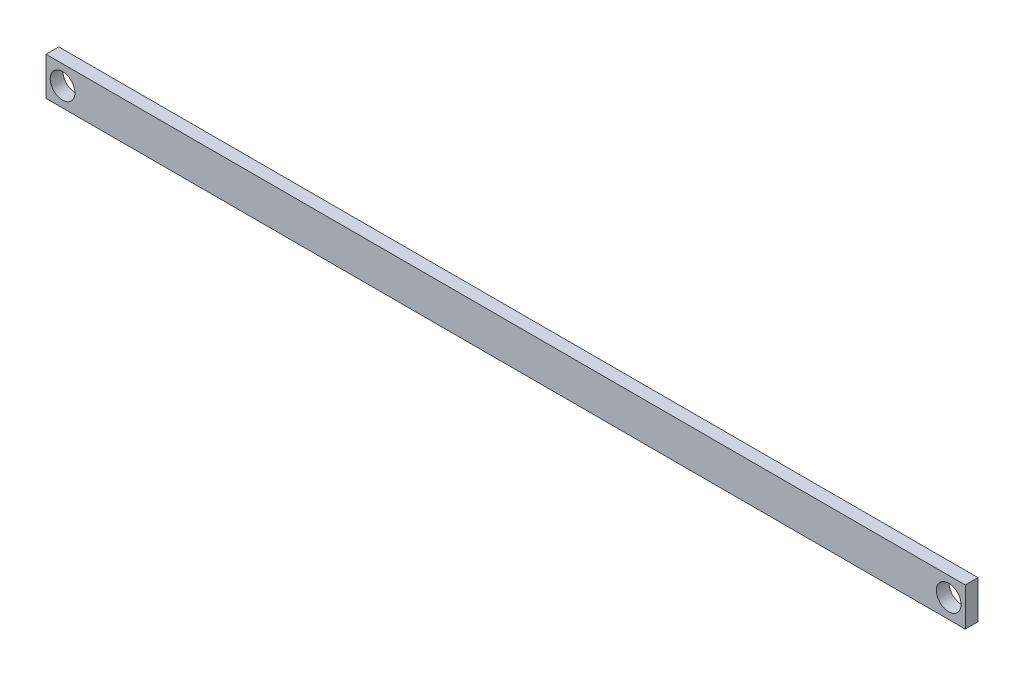
ISO-10303-21;
HEADER;
FILE_DESCRIPTION(('STEP AP214'),'2;1');
FILE_NAME('part.step','',(''),(''),'','','');
FILE_SCHEMA(('AUTOMOTIVE_DESIGN { 1 0 10303 214 1 1 1 1 }'));
ENDSEC;
DATA;
#1=APPLICATION_CONTEXT('core data for automotive mechanical design processes');
#2=APPLICATION_PROTOCOL_DEFINITION('international standard','automotive_design',2000,#1);
#3=PRODUCT_CONTEXT('',#1,'mechanical');
#4=PRODUCT('Part','Part','',(#3));
#5=PRODUCT_RELATED_PRODUCT_CATEGORY('part','',(#4));
#6=PRODUCT_DEFINITION_FORMATION('','',#4);
#7=PRODUCT_DEFINITION_CONTEXT('part definition',#1,'design');
#8=PRODUCT_DEFINITION('design','',#6,#7);
#9=PRODUCT_DEFINITION_SHAPE('','',#8);
#10=(LENGTH_UNIT() NAMED_UNIT(*) SI_UNIT(.MILLI.,.METRE.));
#11=(NAMED_UNIT(*) PLANE_ANGLE_UNIT() SI_UNIT($,.RADIAN.));
#12=(NAMED_UNIT(*) SI_UNIT($,.STERADIAN.) SOLID_ANGLE_UNIT());
#13=UNCERTAINTY_MEASURE_WITH_UNIT(LENGTH_MEASURE(1.E-05),#10,'distance_accuracy_value','');
#14=(GEOMETRIC_REPRESENTATION_CONTEXT(3) GLOBAL_UNCERTAINTY_ASSIGNED_CONTEXT((#13)) GLOBAL_UNIT_ASSIGNED_CONTEXT((#10,
#11,#12)) REPRESENTATION_CONTEXT('',''));
#15=CARTESIAN_POINT('',(0.,0.,0.));
#16=DIRECTION('',(0.,0.,1.));
#17=DIRECTION('',(1.,0.,0.));
#18=AXIS2_PLACEMENT_3D('',#15,#16,#17);
#19=CARTESIAN_POINT('',(0.,0.,-5.));
#20=DIRECTION('',(-1.,0.,0.));
#21=DIRECTION('',(0.,-1.,0.));
#22=AXIS2_PLACEMENT_3D('',#19,#20,#21);
#23=PLANE('',#22);
#24=DIRECTION('',(0.,-1.,0.));
#25=VECTOR('',#24,1.);
#26=CARTESIAN_POINT('',(0.,0.,0.));
#27=LINE('',#26,#25);
#28=CARTESIAN_POINT('',(0.,0.,0.));
#29=VERTEX_POINT('',#28);
#30=CARTESIAN_POINT('',(0.,-15.,0.));
#31=VERTEX_POINT('',#30);
#32=EDGE_CURVE('E117',#29,#31,#27,.T.);
#33=ORIENTED_EDGE('',*,*,#32,.F.);
#34=DIRECTION('',(0.,0.,1.));
#35=VECTOR('',#34,1.);
#36=CARTESIAN_POINT('',(0.,0.,-5.));
#37=LINE('',#36,#35);
#38=CARTESIAN_POINT('',(0.,0.,-5.));
#39=VERTEX_POINT('',#38);
#40=EDGE_CURVE('E11',#39,#29,#37,.T.);
#41=ORIENTED_EDGE('',*,*,#40,.F.);
#42=DIRECTION('',(0.,-1.,0.));
#43=VECTOR('',#42,1.);
#44=CARTESIAN_POINT('',(0.,0.,-5.));
#45=LINE('',#44,#43);
#46=CARTESIAN_POINT('',(0.,-15.,-5.));
#47=VERTEX_POINT('',#46);
#48=EDGE_CURVE('E110',#39,#47,#45,.T.);
#49=ORIENTED_EDGE('',*,*,#48,.T.);
#50=DIRECTION('',(0.,0.,1.));
#51=VECTOR('',#50,1.);
#52=CARTESIAN_POINT('',(0.,-15.,-5.));
#53=LINE('',#52,#51);
#54=EDGE_CURVE('E48',#47,#31,#53,.T.);
#55=ORIENTED_EDGE('',*,*,#54,.T.);
#56=EDGE_LOOP('',(#33,#41,#49,#55));
#57=FACE_BOUND('',#56,.T.);
#58=ADVANCED_FACE('F44',(#57),#23,.T.);
#59=CARTESIAN_POINT('',(0.,0.,-5.));
#60=DIRECTION('',(0.,1.,0.));
#61=DIRECTION('',(0.,0.,1.));
#62=AXIS2_PLACEMENT_3D('',#59,#60,#61);
#63=PLANE('',#62);
#64=DIRECTION('',(-1.,0.,0.));
#65=VECTOR('',#64,1.);
#66=CARTESIAN_POINT('',(0.,0.,0.));
#67=LINE('',#66,#65);
#68=CARTESIAN_POINT('',(360.6,0.,0.));
#69=VERTEX_POINT('',#68);
#70=EDGE_CURVE('E109',#69,#29,#67,.T.);
#71=ORIENTED_EDGE('',*,*,#70,.F.);
#72=DIRECTION('',(0.,0.,1.));
#73=VECTOR('',#72,1.);
#74=CARTESIAN_POINT('',(360.6,0.,-5.));
#75=LINE('',#74,#73);
#76=CARTESIAN_POINT('',(360.6,0.,-5.));
#77=VERTEX_POINT('',#76);
#78=EDGE_CURVE('E54',#77,#69,#75,.T.);
#79=ORIENTED_EDGE('',*,*,#78,.F.);
#80=DIRECTION('',(-1.,0.,0.));
#81=VECTOR('',#80,1.);
#82=CARTESIAN_POINT('',(0.,0.,-5.));
#83=LINE('',#82,#81);
#84=EDGE_CURVE('E105',#77,#39,#83,.T.);
#85=ORIENTED_EDGE('',*,*,#84,.T.);
#86=ORIENTED_EDGE('',*,*,#40,.T.);
#87=EDGE_LOOP('',(#71,#79,#85,#86));
#88=FACE_BOUND('',#87,.T.);
#89=ADVANCED_FACE('F134',(#88),#63,.T.);
#90=CARTESIAN_POINT('',(360.6,-15.,-5.));
#91=DIRECTION('',(1.,0.,0.));
#92=DIRECTION('',(0.,0.,-1.));
#93=AXIS2_PLACEMENT_3D('',#90,#91,#92);
#94=PLANE('',#93);
#95=DIRECTION('',(0.,1.,0.));
#96=VECTOR('',#95,1.);
#97=CARTESIAN_POINT('',(360.6,-15.,0.));
#98=LINE('',#97,#96);
#99=CARTESIAN_POINT('',(360.6,-15.,0.));
#100=VERTEX_POINT('',#99);
#101=EDGE_CURVE('E96',#100,#69,#98,.T.);
#102=ORIENTED_EDGE('',*,*,#101,.F.);
#103=DIRECTION('',(0.,0.,1.));
#104=VECTOR('',#103,1.);
#105=CARTESIAN_POINT('',(360.6,-15.,-5.));
#106=LINE('',#105,#104);
#107=CARTESIAN_POINT('',(360.6,-15.,-5.));
#108=VERTEX_POINT('',#107);
#109=EDGE_CURVE('E93',#108,#100,#106,.T.);
#110=ORIENTED_EDGE('',*,*,#109,.F.);
#111=DIRECTION('',(0.,1.,0.));
#112=VECTOR('',#111,1.);
#113=CARTESIAN_POINT('',(360.6,-15.,-5.));
#114=LINE('',#113,#112);
#115=EDGE_CURVE('E94',#108,#77,#114,.T.);
#116=ORIENTED_EDGE('',*,*,#115,.T.);
#117=ORIENTED_EDGE('',*,*,#78,.T.);
#118=EDGE_LOOP('',(#102,#110,#116,#117));
#119=FACE_BOUND('',#118,.T.);
#120=ADVANCED_FACE('F91',(#119),#94,.T.);
#121=CARTESIAN_POINT('',(0.,-15.,-5.));
#122=DIRECTION('',(0.,-1.,0.));
#123=DIRECTION('',(0.,0.,-1.));
#124=AXIS2_PLACEMENT_3D('',#121,#122,#123);
#125=PLANE('',#124);
#126=DIRECTION('',(1.,0.,0.));
#127=VECTOR('',#126,1.);
#128=CARTESIAN_POINT('',(0.,-15.,0.));
#129=LINE('',#128,#127);
#130=EDGE_CURVE('E118',#31,#100,#129,.T.);
#131=ORIENTED_EDGE('',*,*,#130,.F.);
#132=ORIENTED_EDGE('',*,*,#54,.F.);
#133=DIRECTION('',(1.,0.,0.));
#134=VECTOR('',#133,1.);
#135=CARTESIAN_POINT('',(0.,-15.,-5.));
#136=LINE('',#135,#134);
#137=EDGE_CURVE('E101',#47,#108,#136,.T.);
#138=ORIENTED_EDGE('',*,*,#137,.T.);
#139=ORIENTED_EDGE('',*,*,#109,.T.);
#140=EDGE_LOOP('',(#131,#132,#138,#139));
#141=FACE_BOUND('',#140,.T.);
#142=ADVANCED_FACE('F104',(#141),#125,.T.);
#143=CARTESIAN_POINT('',(0.,0.,-5.));
#144=DIRECTION('',(0.,0.,1.));
#145=DIRECTION('',(1.,0.,0.));
#146=AXIS2_PLACEMENT_3D('',#143,#144,#145);
#147=PLANE('',#146);
#148=CARTESIAN_POINT('',(6.5,-7.5,-5.));
#149=DIRECTION('',(0.,0.,1.));
#150=DIRECTION('',(1.,0.,0.));
#151=AXIS2_PLACEMENT_3D('',#148,#149,#150);
#152=CIRCLE('',#151,4.85);
#153=CARTESIAN_POINT('',(11.35,-7.5,-5.));
#154=VERTEX_POINT('',#153);
#155=EDGE_CURVE('E122',#154,#154,#152,.T.);
#156=ORIENTED_EDGE('',*,*,#155,.T.);
#157=EDGE_LOOP('',(#156));
#158=FACE_BOUND('',#157,.T.);
#159=CARTESIAN_POINT('',(354.1,-7.5,-5.));
#160=DIRECTION('',(0.,0.,1.));
#161=DIRECTION('',(1.,0.,0.));
#162=AXIS2_PLACEMENT_3D('',#159,#160,#161);
#163=CIRCLE('',#162,4.85000000000003);
#164=CARTESIAN_POINT('',(358.95,-7.5,-5.));
#165=VERTEX_POINT('',#164);
#166=EDGE_CURVE('E177',#165,#165,#163,.T.);
#167=ORIENTED_EDGE('',*,*,#166,.T.);
#168=EDGE_LOOP('',(#167));
#169=FACE_BOUND('',#168,.T.);
#170=ORIENTED_EDGE('',*,*,#48,.F.);
#171=ORIENTED_EDGE('',*,*,#84,.F.);
#172=ORIENTED_EDGE('',*,*,#115,.F.);
#173=ORIENTED_EDGE('',*,*,#137,.F.);
#174=EDGE_LOOP('',(#170,#171,#172,#173));
#175=FACE_BOUND('',#174,.T.);
#176=ADVANCED_FACE('F99',(#158,#169,#175),#147,.F.);
#177=CARTESIAN_POINT('',(0.,0.,0.));
#178=DIRECTION('',(0.,0.,1.));
#179=DIRECTION('',(1.,0.,0.));
#180=AXIS2_PLACEMENT_3D('',#177,#178,#179);
#181=PLANE('',#180);
#182=CARTESIAN_POINT('',(6.5,-7.5,0.));
#183=DIRECTION('',(0.,0.,1.));
#184=DIRECTION('',(1.,0.,0.));
#185=AXIS2_PLACEMENT_3D('',#182,#183,#184);
#186=CIRCLE('',#185,4.85);
#187=CARTESIAN_POINT('',(11.35,-7.5,0.));
#188=VERTEX_POINT('',#187);
#189=EDGE_CURVE('E169',#188,#188,#186,.T.);
#190=ORIENTED_EDGE('',*,*,#189,.F.);
#191=EDGE_LOOP('',(#190));
#192=FACE_BOUND('',#191,.T.);
#193=CARTESIAN_POINT('',(354.1,-7.5,0.));
#194=DIRECTION('',(0.,0.,1.));
#195=DIRECTION('',(1.,0.,0.));
#196=AXIS2_PLACEMENT_3D('',#193,#194,#195);
#197=CIRCLE('',#196,4.85000000000003);
#198=CARTESIAN_POINT('',(358.95,-7.5,0.));
#199=VERTEX_POINT('',#198);
#200=EDGE_CURVE('E168',#199,#199,#197,.T.);
#201=ORIENTED_EDGE('',*,*,#200,.F.);
#202=EDGE_LOOP('',(#201));
#203=FACE_BOUND('',#202,.T.);
#204=ORIENTED_EDGE('',*,*,#32,.T.);
#205=ORIENTED_EDGE('',*,*,#130,.T.);
#206=ORIENTED_EDGE('',*,*,#101,.T.);
#207=ORIENTED_EDGE('',*,*,#70,.T.);
#208=EDGE_LOOP('',(#204,#205,#206,#207));
#209=FACE_BOUND('',#208,.T.);
#210=ADVANCED_FACE('F135',(#192,#203,#209),#181,.T.);
#211=CARTESIAN_POINT('',(354.1,-7.5,-5.));
#212=DIRECTION('',(0.,0.,1.));
#213=DIRECTION('',(1.,0.,0.));
#214=AXIS2_PLACEMENT_3D('',#211,#212,#213);
#215=CYLINDRICAL_SURFACE('',#214,4.85000000000003);
#216=ORIENTED_EDGE('',*,*,#166,.F.);
#217=EDGE_LOOP('',(#216));
#218=FACE_BOUND('',#217,.T.);
#219=ORIENTED_EDGE('',*,*,#200,.T.);
#220=EDGE_LOOP('',(#219));
#221=FACE_BOUND('',#220,.T.);
#222=ADVANCED_FACE('F151',(#218,#221),#215,.F.);
#223=CARTESIAN_POINT('',(6.5,-7.5,-5.));
#224=DIRECTION('',(0.,0.,1.));
#225=DIRECTION('',(1.,0.,0.));
#226=AXIS2_PLACEMENT_3D('',#223,#224,#225);
#227=CYLINDRICAL_SURFACE('',#226,4.85);
#228=ORIENTED_EDGE('',*,*,#155,.F.);
#229=EDGE_LOOP('',(#228));
#230=FACE_BOUND('',#229,.T.);
#231=ORIENTED_EDGE('',*,*,#189,.T.);
#232=EDGE_LOOP('',(#231));
#233=FACE_BOUND('',#232,.T.);
#234=ADVANCED_FACE('F158',(#230,#233),#227,.F.);
#235=CLOSED_SHELL('',(#58,#89,#120,#142,#176,#210,#222,#234));
#236=MANIFOLD_SOLID_BREP('B2',#235);
#237=ADVANCED_BREP_SHAPE_REPRESENTATION('',(#18,#236),#14);
#238=SHAPE_DEFINITION_REPRESENTATION(#9,#237);
ENDSEC;
END-ISO-10303-21;
